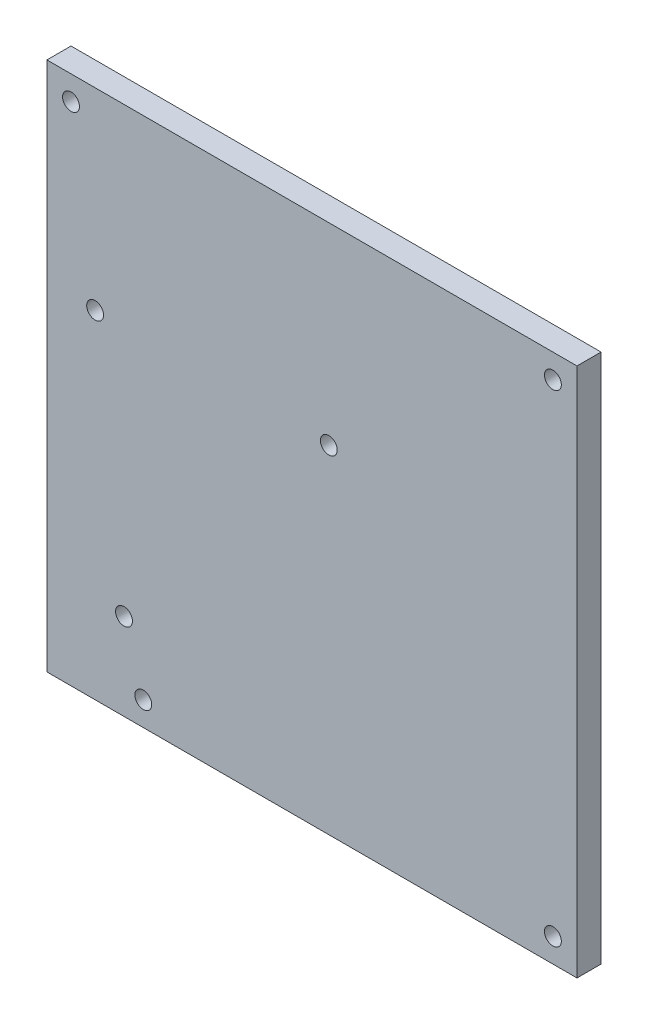
ISO-10303-21;
HEADER;
FILE_DESCRIPTION(('STEP AP214'),'2;1');
FILE_NAME('part.step','',(''),(''),'','','');
FILE_SCHEMA(('AUTOMOTIVE_DESIGN { 1 0 10303 214 1 1 1 1 }'));
ENDSEC;
DATA;
#1=APPLICATION_CONTEXT('core data for automotive mechanical design processes');
#2=APPLICATION_PROTOCOL_DEFINITION('international standard','automotive_design',2000,#1);
#3=PRODUCT_CONTEXT('',#1,'mechanical');
#4=PRODUCT('Part','Part','',(#3));
#5=PRODUCT_RELATED_PRODUCT_CATEGORY('part','',(#4));
#6=PRODUCT_DEFINITION_FORMATION('','',#4);
#7=PRODUCT_DEFINITION_CONTEXT('part definition',#1,'design');
#8=PRODUCT_DEFINITION('design','',#6,#7);
#9=PRODUCT_DEFINITION_SHAPE('','',#8);
#10=(LENGTH_UNIT() NAMED_UNIT(*) SI_UNIT(.MILLI.,.METRE.));
#11=(NAMED_UNIT(*) PLANE_ANGLE_UNIT() SI_UNIT($,.RADIAN.));
#12=(NAMED_UNIT(*) SI_UNIT($,.STERADIAN.) SOLID_ANGLE_UNIT());
#13=UNCERTAINTY_MEASURE_WITH_UNIT(LENGTH_MEASURE(1.E-05),#10,'distance_accuracy_value','');
#14=(GEOMETRIC_REPRESENTATION_CONTEXT(3) GLOBAL_UNCERTAINTY_ASSIGNED_CONTEXT((#13)) GLOBAL_UNIT_ASSIGNED_CONTEXT((#10,
#11,#12)) REPRESENTATION_CONTEXT('',''));
#15=CARTESIAN_POINT('',(0.,0.,0.));
#16=DIRECTION('',(0.,0.,1.));
#17=DIRECTION('',(1.,0.,0.));
#18=AXIS2_PLACEMENT_3D('',#15,#16,#17);
#19=CARTESIAN_POINT('',(0.,0.,5.));
#20=DIRECTION('',(0.,0.,1.));
#21=DIRECTION('',(1.,0.,0.));
#22=AXIS2_PLACEMENT_3D('',#19,#20,#21);
#23=PLANE('',#22);
#24=CARTESIAN_POINT('',(58.5,-40.,5.));
#25=DIRECTION('',(0.,0.,1.));
#26=DIRECTION('',(1.,0.,0.));
#27=AXIS2_PLACEMENT_3D('',#24,#25,#26);
#28=CIRCLE('',#27,1.75);
#29=CARTESIAN_POINT('',(60.25,-40.,5.));
#30=VERTEX_POINT('',#29);
#31=EDGE_CURVE('E145',#30,#30,#28,.T.);
#32=ORIENTED_EDGE('',*,*,#31,.F.);
#33=EDGE_LOOP('',(#32));
#34=FACE_BOUND('',#33,.T.);
#35=CARTESIAN_POINT('',(105.,-105.,5.));
#36=DIRECTION('',(0.,0.,1.));
#37=DIRECTION('',(1.,0.,0.));
#38=AXIS2_PLACEMENT_3D('',#35,#36,#37);
#39=CIRCLE('',#38,1.75);
#40=CARTESIAN_POINT('',(106.75,-105.,5.));
#41=VERTEX_POINT('',#40);
#42=EDGE_CURVE('E133',#41,#41,#39,.T.);
#43=ORIENTED_EDGE('',*,*,#42,.F.);
#44=EDGE_LOOP('',(#43));
#45=FACE_BOUND('',#44,.T.);
#46=CARTESIAN_POINT('',(105.,-5.,5.));
#47=DIRECTION('',(0.,0.,1.));
#48=DIRECTION('',(1.,0.,0.));
#49=AXIS2_PLACEMENT_3D('',#46,#47,#48);
#50=CIRCLE('',#49,1.75);
#51=CARTESIAN_POINT('',(106.75,-5.,5.));
#52=VERTEX_POINT('',#51);
#53=EDGE_CURVE('E121',#52,#52,#50,.T.);
#54=ORIENTED_EDGE('',*,*,#53,.F.);
#55=EDGE_LOOP('',(#54));
#56=FACE_BOUND('',#55,.T.);
#57=DIRECTION('',(0.,-1.,0.));
#58=VECTOR('',#57,1.);
#59=CARTESIAN_POINT('',(0.,0.,5.));
#60=LINE('',#59,#58);
#61=CARTESIAN_POINT('',(0.,0.,5.));
#62=VERTEX_POINT('',#61);
#63=CARTESIAN_POINT('',(0.,-110.,5.));
#64=VERTEX_POINT('',#63);
#65=EDGE_CURVE('E91',#62,#64,#60,.T.);
#66=ORIENTED_EDGE('',*,*,#65,.T.);
#67=DIRECTION('',(1.,0.,0.));
#68=VECTOR('',#67,1.);
#69=CARTESIAN_POINT('',(0.,-110.,5.));
#70=LINE('',#69,#68);
#71=CARTESIAN_POINT('',(110.,-110.,5.));
#72=VERTEX_POINT('',#71);
#73=EDGE_CURVE('E86',#64,#72,#70,.T.);
#74=ORIENTED_EDGE('',*,*,#73,.T.);
#75=DIRECTION('',(0.,1.,0.));
#76=VECTOR('',#75,1.);
#77=CARTESIAN_POINT('',(110.,0.,5.));
#78=LINE('',#77,#76);
#79=CARTESIAN_POINT('',(110.,0.,5.));
#80=VERTEX_POINT('',#79);
#81=EDGE_CURVE('E89',#72,#80,#78,.T.);
#82=ORIENTED_EDGE('',*,*,#81,.T.);
#83=DIRECTION('',(-1.,0.,0.));
#84=VECTOR('',#83,1.);
#85=CARTESIAN_POINT('',(0.,0.,5.));
#86=LINE('',#85,#84);
#87=EDGE_CURVE('E56',#80,#62,#86,.T.);
#88=ORIENTED_EDGE('',*,*,#87,.T.);
#89=EDGE_LOOP('',(#66,#74,#82,#88));
#90=FACE_BOUND('',#89,.T.);
#91=CARTESIAN_POINT('',(5.,-5.,5.));
#92=DIRECTION('',(0.,0.,1.));
#93=DIRECTION('',(1.,0.,0.));
#94=AXIS2_PLACEMENT_3D('',#91,#92,#93);
#95=CIRCLE('',#94,1.75);
#96=CARTESIAN_POINT('',(6.75,-5.,5.));
#97=VERTEX_POINT('',#96);
#98=EDGE_CURVE('E106',#97,#97,#95,.T.);
#99=ORIENTED_EDGE('',*,*,#98,.F.);
#100=EDGE_LOOP('',(#99));
#101=FACE_BOUND('',#100,.T.);
#102=CARTESIAN_POINT('',(20.,-105.,5.));
#103=DIRECTION('',(0.,0.,1.));
#104=DIRECTION('',(1.,0.,0.));
#105=AXIS2_PLACEMENT_3D('',#102,#103,#104);
#106=CIRCLE('',#105,1.75);
#107=CARTESIAN_POINT('',(21.75,-105.,5.));
#108=VERTEX_POINT('',#107);
#109=EDGE_CURVE('E127',#108,#108,#106,.T.);
#110=ORIENTED_EDGE('',*,*,#109,.F.);
#111=EDGE_LOOP('',(#110));
#112=FACE_BOUND('',#111,.T.);
#113=CARTESIAN_POINT('',(10.,-40.,5.));
#114=DIRECTION('',(0.,0.,1.));
#115=DIRECTION('',(1.,0.,0.));
#116=AXIS2_PLACEMENT_3D('',#113,#114,#115);
#117=CIRCLE('',#116,1.75);
#118=CARTESIAN_POINT('',(11.75,-40.,5.));
#119=VERTEX_POINT('',#118);
#120=EDGE_CURVE('E139',#119,#119,#117,.T.);
#121=ORIENTED_EDGE('',*,*,#120,.F.);
#122=EDGE_LOOP('',(#121));
#123=FACE_BOUND('',#122,.T.);
#124=CARTESIAN_POINT('',(16.,-92.,5.));
#125=DIRECTION('',(0.,0.,1.));
#126=DIRECTION('',(1.,0.,0.));
#127=AXIS2_PLACEMENT_3D('',#124,#125,#126);
#128=CIRCLE('',#127,1.75);
#129=CARTESIAN_POINT('',(17.75,-92.,5.));
#130=VERTEX_POINT('',#129);
#131=EDGE_CURVE('E151',#130,#130,#128,.T.);
#132=ORIENTED_EDGE('',*,*,#131,.F.);
#133=EDGE_LOOP('',(#132));
#134=FACE_BOUND('',#133,.T.);
#135=ADVANCED_FACE('F39',(#34,#45,#56,#90,#101,#112,#123,#134),#23,.T.);
#136=CARTESIAN_POINT('',(0.,0.,0.));
#137=DIRECTION('',(0.,0.,1.));
#138=DIRECTION('',(1.,0.,0.));
#139=AXIS2_PLACEMENT_3D('',#136,#137,#138);
#140=PLANE('',#139);
#141=DIRECTION('',(0.,-1.,0.));
#142=VECTOR('',#141,1.);
#143=CARTESIAN_POINT('',(0.,0.,0.));
#144=LINE('',#143,#142);
#145=CARTESIAN_POINT('',(0.,0.,0.));
#146=VERTEX_POINT('',#145);
#147=CARTESIAN_POINT('',(0.,-110.,0.));
#148=VERTEX_POINT('',#147);
#149=EDGE_CURVE('E103',#146,#148,#144,.T.);
#150=ORIENTED_EDGE('',*,*,#149,.F.);
#151=DIRECTION('',(-1.,0.,0.));
#152=VECTOR('',#151,1.);
#153=CARTESIAN_POINT('',(0.,0.,0.));
#154=LINE('',#153,#152);
#155=CARTESIAN_POINT('',(110.,0.,0.));
#156=VERTEX_POINT('',#155);
#157=EDGE_CURVE('E79',#156,#146,#154,.T.);
#158=ORIENTED_EDGE('',*,*,#157,.F.);
#159=DIRECTION('',(0.,1.,0.));
#160=VECTOR('',#159,1.);
#161=CARTESIAN_POINT('',(110.,0.,0.));
#162=LINE('',#161,#160);
#163=CARTESIAN_POINT('',(110.,-110.,0.));
#164=VERTEX_POINT('',#163);
#165=EDGE_CURVE('E73',#164,#156,#162,.T.);
#166=ORIENTED_EDGE('',*,*,#165,.F.);
#167=DIRECTION('',(1.,0.,0.));
#168=VECTOR('',#167,1.);
#169=CARTESIAN_POINT('',(0.,-110.,0.));
#170=LINE('',#169,#168);
#171=EDGE_CURVE('E95',#148,#164,#170,.T.);
#172=ORIENTED_EDGE('',*,*,#171,.F.);
#173=EDGE_LOOP('',(#150,#158,#166,#172));
#174=FACE_BOUND('',#173,.T.);
#175=CARTESIAN_POINT('',(5.,-5.,0.));
#176=DIRECTION('',(0.,0.,1.));
#177=DIRECTION('',(1.,0.,0.));
#178=AXIS2_PLACEMENT_3D('',#175,#176,#177);
#179=CIRCLE('',#178,1.75);
#180=CARTESIAN_POINT('',(6.75,-5.,0.));
#181=VERTEX_POINT('',#180);
#182=EDGE_CURVE('E118',#181,#181,#179,.T.);
#183=ORIENTED_EDGE('',*,*,#182,.T.);
#184=EDGE_LOOP('',(#183));
#185=FACE_BOUND('',#184,.T.);
#186=CARTESIAN_POINT('',(105.,-5.,0.));
#187=DIRECTION('',(0.,0.,1.));
#188=DIRECTION('',(1.,0.,0.));
#189=AXIS2_PLACEMENT_3D('',#186,#187,#188);
#190=CIRCLE('',#189,1.75);
#191=CARTESIAN_POINT('',(106.75,-5.,0.));
#192=VERTEX_POINT('',#191);
#193=EDGE_CURVE('E124',#192,#192,#190,.T.);
#194=ORIENTED_EDGE('',*,*,#193,.T.);
#195=EDGE_LOOP('',(#194));
#196=FACE_BOUND('',#195,.T.);
#197=CARTESIAN_POINT('',(20.,-105.,0.));
#198=DIRECTION('',(0.,0.,1.));
#199=DIRECTION('',(1.,0.,0.));
#200=AXIS2_PLACEMENT_3D('',#197,#198,#199);
#201=CIRCLE('',#200,1.75);
#202=CARTESIAN_POINT('',(21.75,-105.,0.));
#203=VERTEX_POINT('',#202);
#204=EDGE_CURVE('E130',#203,#203,#201,.T.);
#205=ORIENTED_EDGE('',*,*,#204,.T.);
#206=EDGE_LOOP('',(#205));
#207=FACE_BOUND('',#206,.T.);
#208=CARTESIAN_POINT('',(105.,-105.,0.));
#209=DIRECTION('',(0.,0.,1.));
#210=DIRECTION('',(1.,0.,0.));
#211=AXIS2_PLACEMENT_3D('',#208,#209,#210);
#212=CIRCLE('',#211,1.75);
#213=CARTESIAN_POINT('',(106.75,-105.,0.));
#214=VERTEX_POINT('',#213);
#215=EDGE_CURVE('E136',#214,#214,#212,.T.);
#216=ORIENTED_EDGE('',*,*,#215,.T.);
#217=EDGE_LOOP('',(#216));
#218=FACE_BOUND('',#217,.T.);
#219=CARTESIAN_POINT('',(10.,-40.,0.));
#220=DIRECTION('',(0.,0.,1.));
#221=DIRECTION('',(1.,0.,0.));
#222=AXIS2_PLACEMENT_3D('',#219,#220,#221);
#223=CIRCLE('',#222,1.75);
#224=CARTESIAN_POINT('',(11.75,-40.,0.));
#225=VERTEX_POINT('',#224);
#226=EDGE_CURVE('E142',#225,#225,#223,.T.);
#227=ORIENTED_EDGE('',*,*,#226,.T.);
#228=EDGE_LOOP('',(#227));
#229=FACE_BOUND('',#228,.T.);
#230=CARTESIAN_POINT('',(58.5,-40.,0.));
#231=DIRECTION('',(0.,0.,1.));
#232=DIRECTION('',(1.,0.,0.));
#233=AXIS2_PLACEMENT_3D('',#230,#231,#232);
#234=CIRCLE('',#233,1.75);
#235=CARTESIAN_POINT('',(60.25,-40.,0.));
#236=VERTEX_POINT('',#235);
#237=EDGE_CURVE('E148',#236,#236,#234,.T.);
#238=ORIENTED_EDGE('',*,*,#237,.T.);
#239=EDGE_LOOP('',(#238));
#240=FACE_BOUND('',#239,.T.);
#241=CARTESIAN_POINT('',(16.,-92.,0.));
#242=DIRECTION('',(0.,0.,1.));
#243=DIRECTION('',(1.,0.,0.));
#244=AXIS2_PLACEMENT_3D('',#241,#242,#243);
#245=CIRCLE('',#244,1.75);
#246=CARTESIAN_POINT('',(17.75,-92.,0.));
#247=VERTEX_POINT('',#246);
#248=EDGE_CURVE('E154',#247,#247,#245,.T.);
#249=ORIENTED_EDGE('',*,*,#248,.T.);
#250=EDGE_LOOP('',(#249));
#251=FACE_BOUND('',#250,.T.);
#252=ADVANCED_FACE('F114',(#174,#185,#196,#207,#218,#229,#240,#251),#140,.F.);
#253=CARTESIAN_POINT('',(0.,0.,5.));
#254=DIRECTION('',(1.,0.,0.));
#255=DIRECTION('',(0.,1.,0.));
#256=AXIS2_PLACEMENT_3D('',#253,#254,#255);
#257=PLANE('',#256);
#258=ORIENTED_EDGE('',*,*,#149,.T.);
#259=DIRECTION('',(0.,0.,-1.));
#260=VECTOR('',#259,1.);
#261=CARTESIAN_POINT('',(0.,-110.,5.));
#262=LINE('',#261,#260);
#263=EDGE_CURVE('E11',#64,#148,#262,.T.);
#264=ORIENTED_EDGE('',*,*,#263,.F.);
#265=ORIENTED_EDGE('',*,*,#65,.F.);
#266=DIRECTION('',(0.,0.,-1.));
#267=VECTOR('',#266,1.);
#268=CARTESIAN_POINT('',(0.,0.,5.));
#269=LINE('',#268,#267);
#270=EDGE_CURVE('E99',#62,#146,#269,.T.);
#271=ORIENTED_EDGE('',*,*,#270,.T.);
#272=EDGE_LOOP('',(#258,#264,#265,#271));
#273=FACE_BOUND('',#272,.T.);
#274=ADVANCED_FACE('F41',(#273),#257,.F.);
#275=CARTESIAN_POINT('',(0.,-110.,5.));
#276=DIRECTION('',(0.,1.,0.));
#277=DIRECTION('',(0.,0.,1.));
#278=AXIS2_PLACEMENT_3D('',#275,#276,#277);
#279=PLANE('',#278);
#280=ORIENTED_EDGE('',*,*,#171,.T.);
#281=DIRECTION('',(0.,0.,-1.));
#282=VECTOR('',#281,1.);
#283=CARTESIAN_POINT('',(110.,-110.,5.));
#284=LINE('',#283,#282);
#285=EDGE_CURVE('E48',#72,#164,#284,.T.);
#286=ORIENTED_EDGE('',*,*,#285,.F.);
#287=ORIENTED_EDGE('',*,*,#73,.F.);
#288=ORIENTED_EDGE('',*,*,#263,.T.);
#289=EDGE_LOOP('',(#280,#286,#287,#288));
#290=FACE_BOUND('',#289,.T.);
#291=ADVANCED_FACE('F94',(#290),#279,.F.);
#292=CARTESIAN_POINT('',(110.,0.,5.));
#293=DIRECTION('',(-1.,0.,0.));
#294=DIRECTION('',(0.,-1.,0.));
#295=AXIS2_PLACEMENT_3D('',#292,#293,#294);
#296=PLANE('',#295);
#297=ORIENTED_EDGE('',*,*,#165,.T.);
#298=DIRECTION('',(0.,0.,-1.));
#299=VECTOR('',#298,1.);
#300=CARTESIAN_POINT('',(110.,0.,5.));
#301=LINE('',#300,#299);
#302=EDGE_CURVE('E96',#80,#156,#301,.T.);
#303=ORIENTED_EDGE('',*,*,#302,.F.);
#304=ORIENTED_EDGE('',*,*,#81,.F.);
#305=ORIENTED_EDGE('',*,*,#285,.T.);
#306=EDGE_LOOP('',(#297,#303,#304,#305));
#307=FACE_BOUND('',#306,.T.);
#308=ADVANCED_FACE('F97',(#307),#296,.F.);
#309=CARTESIAN_POINT('',(0.,0.,5.));
#310=DIRECTION('',(0.,-1.,0.));
#311=DIRECTION('',(0.,0.,-1.));
#312=AXIS2_PLACEMENT_3D('',#309,#310,#311);
#313=PLANE('',#312);
#314=ORIENTED_EDGE('',*,*,#157,.T.);
#315=ORIENTED_EDGE('',*,*,#270,.F.);
#316=ORIENTED_EDGE('',*,*,#87,.F.);
#317=ORIENTED_EDGE('',*,*,#302,.T.);
#318=EDGE_LOOP('',(#314,#315,#316,#317));
#319=FACE_BOUND('',#318,.T.);
#320=ADVANCED_FACE('F111',(#319),#313,.F.);
#321=CARTESIAN_POINT('',(5.,-5.,5.));
#322=DIRECTION('',(0.,0.,-1.));
#323=DIRECTION('',(-1.,0.,0.));
#324=AXIS2_PLACEMENT_3D('',#321,#322,#323);
#325=CYLINDRICAL_SURFACE('',#324,1.75);
#326=ORIENTED_EDGE('',*,*,#98,.T.);
#327=EDGE_LOOP('',(#326));
#328=FACE_BOUND('',#327,.T.);
#329=ORIENTED_EDGE('',*,*,#182,.F.);
#330=EDGE_LOOP('',(#329));
#331=FACE_BOUND('',#330,.T.);
#332=ADVANCED_FACE('F173',(#328,#331),#325,.F.);
#333=CARTESIAN_POINT('',(105.,-5.,5.));
#334=DIRECTION('',(0.,0.,-1.));
#335=DIRECTION('',(-1.,0.,0.));
#336=AXIS2_PLACEMENT_3D('',#333,#334,#335);
#337=CYLINDRICAL_SURFACE('',#336,1.75);
#338=ORIENTED_EDGE('',*,*,#53,.T.);
#339=EDGE_LOOP('',(#338));
#340=FACE_BOUND('',#339,.T.);
#341=ORIENTED_EDGE('',*,*,#193,.F.);
#342=EDGE_LOOP('',(#341));
#343=FACE_BOUND('',#342,.T.);
#344=ADVANCED_FACE('F227',(#340,#343),#337,.F.);
#345=CARTESIAN_POINT('',(20.,-105.,5.));
#346=DIRECTION('',(0.,0.,-1.));
#347=DIRECTION('',(-1.,0.,0.));
#348=AXIS2_PLACEMENT_3D('',#345,#346,#347);
#349=CYLINDRICAL_SURFACE('',#348,1.75);
#350=ORIENTED_EDGE('',*,*,#109,.T.);
#351=EDGE_LOOP('',(#350));
#352=FACE_BOUND('',#351,.T.);
#353=ORIENTED_EDGE('',*,*,#204,.F.);
#354=EDGE_LOOP('',(#353));
#355=FACE_BOUND('',#354,.T.);
#356=ADVANCED_FACE('F236',(#352,#355),#349,.F.);
#357=CARTESIAN_POINT('',(105.,-105.,5.));
#358=DIRECTION('',(0.,0.,-1.));
#359=DIRECTION('',(-1.,0.,0.));
#360=AXIS2_PLACEMENT_3D('',#357,#358,#359);
#361=CYLINDRICAL_SURFACE('',#360,1.75);
#362=ORIENTED_EDGE('',*,*,#42,.T.);
#363=EDGE_LOOP('',(#362));
#364=FACE_BOUND('',#363,.T.);
#365=ORIENTED_EDGE('',*,*,#215,.F.);
#366=EDGE_LOOP('',(#365));
#367=FACE_BOUND('',#366,.T.);
#368=ADVANCED_FACE('F245',(#364,#367),#361,.F.);
#369=CARTESIAN_POINT('',(10.,-40.,5.));
#370=DIRECTION('',(0.,0.,-1.));
#371=DIRECTION('',(-1.,0.,0.));
#372=AXIS2_PLACEMENT_3D('',#369,#370,#371);
#373=CYLINDRICAL_SURFACE('',#372,1.75);
#374=ORIENTED_EDGE('',*,*,#120,.T.);
#375=EDGE_LOOP('',(#374));
#376=FACE_BOUND('',#375,.T.);
#377=ORIENTED_EDGE('',*,*,#226,.F.);
#378=EDGE_LOOP('',(#377));
#379=FACE_BOUND('',#378,.T.);
#380=ADVANCED_FACE('F255',(#376,#379),#373,.F.);
#381=CARTESIAN_POINT('',(58.5,-40.,5.));
#382=DIRECTION('',(0.,0.,-1.));
#383=DIRECTION('',(-1.,0.,0.));
#384=AXIS2_PLACEMENT_3D('',#381,#382,#383);
#385=CYLINDRICAL_SURFACE('',#384,1.75);
#386=ORIENTED_EDGE('',*,*,#31,.T.);
#387=EDGE_LOOP('',(#386));
#388=FACE_BOUND('',#387,.T.);
#389=ORIENTED_EDGE('',*,*,#237,.F.);
#390=EDGE_LOOP('',(#389));
#391=FACE_BOUND('',#390,.T.);
#392=ADVANCED_FACE('F265',(#388,#391),#385,.F.);
#393=CARTESIAN_POINT('',(16.,-92.,5.));
#394=DIRECTION('',(0.,0.,-1.));
#395=DIRECTION('',(-1.,0.,0.));
#396=AXIS2_PLACEMENT_3D('',#393,#394,#395);
#397=CYLINDRICAL_SURFACE('',#396,1.75);
#398=ORIENTED_EDGE('',*,*,#131,.T.);
#399=EDGE_LOOP('',(#398));
#400=FACE_BOUND('',#399,.T.);
#401=ORIENTED_EDGE('',*,*,#248,.F.);
#402=EDGE_LOOP('',(#401));
#403=FACE_BOUND('',#402,.T.);
#404=ADVANCED_FACE('F160',(#400,#403),#397,.F.);
#405=CLOSED_SHELL('',(#135,#252,#274,#291,#308,#320,#332,#344,#356,#368,#380,#392,#404));
#406=MANIFOLD_SOLID_BREP('B2',#405);
#407=ADVANCED_BREP_SHAPE_REPRESENTATION('',(#18,#406),#14);
#408=SHAPE_DEFINITION_REPRESENTATION(#9,#407);
ENDSEC;
END-ISO-10303-21;
